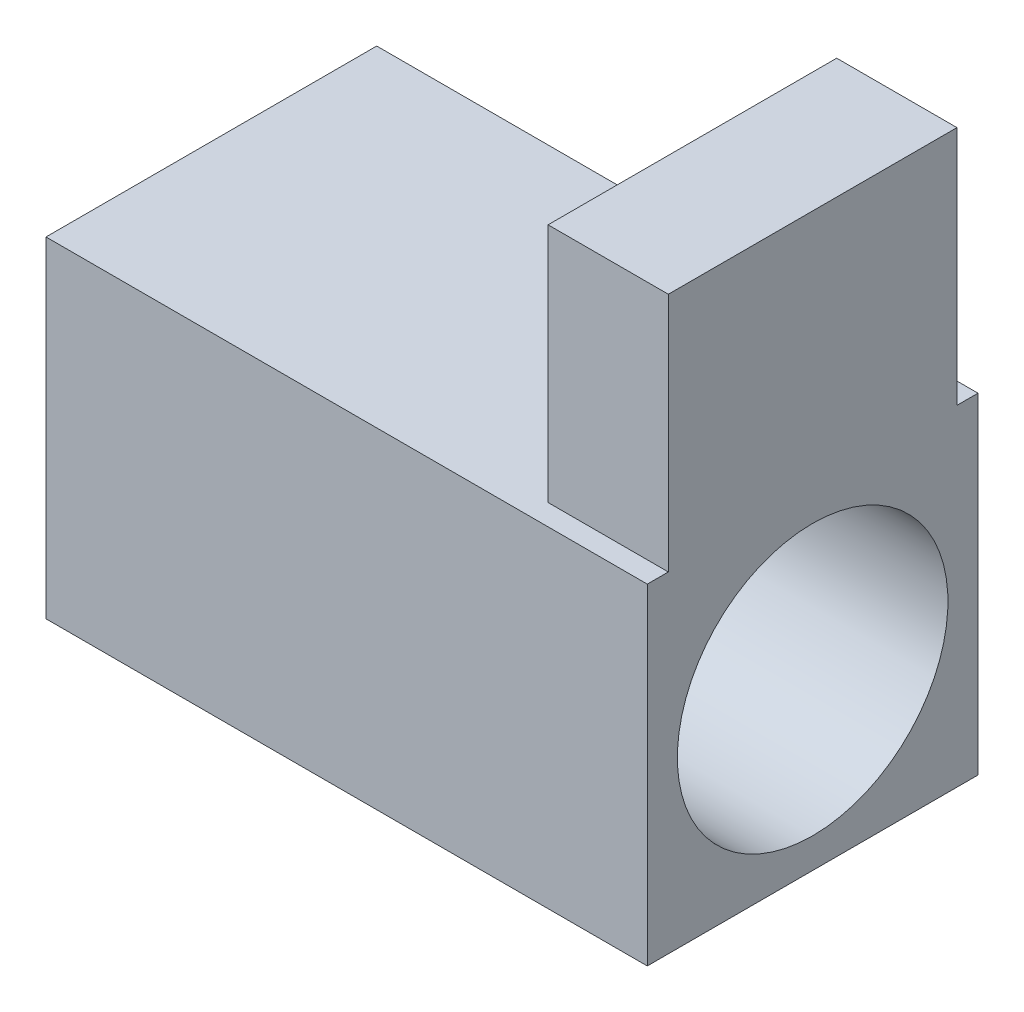
ISO-10303-21;
HEADER;
FILE_DESCRIPTION(('STEP AP214'),'2;1');
FILE_NAME('part.step','',(''),(''),'','','');
FILE_SCHEMA(('AUTOMOTIVE_DESIGN { 1 0 10303 214 1 1 1 1 }'));
ENDSEC;
DATA;
#1=APPLICATION_CONTEXT('core data for automotive mechanical design processes');
#2=APPLICATION_PROTOCOL_DEFINITION('international standard','automotive_design',2000,#1);
#3=PRODUCT_CONTEXT('',#1,'mechanical');
#4=PRODUCT('Part','Part','',(#3));
#5=PRODUCT_RELATED_PRODUCT_CATEGORY('part','',(#4));
#6=PRODUCT_DEFINITION_FORMATION('','',#4);
#7=PRODUCT_DEFINITION_CONTEXT('part definition',#1,'design');
#8=PRODUCT_DEFINITION('design','',#6,#7);
#9=PRODUCT_DEFINITION_SHAPE('','',#8);
#10=(LENGTH_UNIT() NAMED_UNIT(*) SI_UNIT(.MILLI.,.METRE.));
#11=(NAMED_UNIT(*) PLANE_ANGLE_UNIT() SI_UNIT($,.RADIAN.));
#12=(NAMED_UNIT(*) SI_UNIT($,.STERADIAN.) SOLID_ANGLE_UNIT());
#13=UNCERTAINTY_MEASURE_WITH_UNIT(LENGTH_MEASURE(1.E-05),#10,'distance_accuracy_value','');
#14=(GEOMETRIC_REPRESENTATION_CONTEXT(3) GLOBAL_UNCERTAINTY_ASSIGNED_CONTEXT((#13)) GLOBAL_UNIT_ASSIGNED_CONTEXT((#10,
#11,#12)) REPRESENTATION_CONTEXT('',''));
#15=CARTESIAN_POINT('',(0.,0.,0.));
#16=DIRECTION('',(0.,0.,1.));
#17=DIRECTION('',(1.,0.,0.));
#18=AXIS2_PLACEMENT_3D('',#15,#16,#17);
#19=CARTESIAN_POINT('',(-5.,2.75,2.75));
#20=DIRECTION('',(0.,-1.,0.));
#21=DIRECTION('',(0.,0.,-1.));
#22=AXIS2_PLACEMENT_3D('',#19,#20,#21);
#23=PLANE('',#22);
#24=DIRECTION('',(1.,0.,0.));
#25=VECTOR('',#24,1.);
#26=CARTESIAN_POINT('',(3.,2.75,2.4));
#27=LINE('',#26,#25);
#28=CARTESIAN_POINT('',(3.,2.75,2.4));
#29=VERTEX_POINT('',#28);
#30=CARTESIAN_POINT('',(5.,2.75,2.4));
#31=VERTEX_POINT('',#30);
#32=EDGE_CURVE('E52',#29,#31,#27,.T.);
#33=ORIENTED_EDGE('',*,*,#32,.F.);
#34=DIRECTION('',(0.,0.,1.));
#35=VECTOR('',#34,1.);
#36=CARTESIAN_POINT('',(3.,2.75,-2.4));
#37=LINE('',#36,#35);
#38=CARTESIAN_POINT('',(3.,2.75,-2.4));
#39=VERTEX_POINT('',#38);
#40=EDGE_CURVE('E185',#39,#29,#37,.T.);
#41=ORIENTED_EDGE('',*,*,#40,.F.);
#42=DIRECTION('',(-1.,0.,0.));
#43=VECTOR('',#42,1.);
#44=CARTESIAN_POINT('',(3.,2.75,-2.4));
#45=LINE('',#44,#43);
#46=CARTESIAN_POINT('',(5.,2.75,-2.4));
#47=VERTEX_POINT('',#46);
#48=EDGE_CURVE('E56',#47,#39,#45,.T.);
#49=ORIENTED_EDGE('',*,*,#48,.F.);
#50=DIRECTION('',(0.,0.,-1.));
#51=VECTOR('',#50,1.);
#52=CARTESIAN_POINT('',(5.,2.75,2.75));
#53=LINE('',#52,#51);
#54=CARTESIAN_POINT('',(5.,2.75,-2.75));
#55=VERTEX_POINT('',#54);
#56=EDGE_CURVE('E50',#47,#55,#53,.T.);
#57=ORIENTED_EDGE('',*,*,#56,.T.);
#58=DIRECTION('',(-1.,0.,0.));
#59=VECTOR('',#58,1.);
#60=CARTESIAN_POINT('',(-5.,2.75,-2.75));
#61=LINE('',#60,#59);
#62=CARTESIAN_POINT('',(-5.,2.75,-2.75));
#63=VERTEX_POINT('',#62);
#64=EDGE_CURVE('E150',#55,#63,#61,.T.);
#65=ORIENTED_EDGE('',*,*,#64,.T.);
#66=DIRECTION('',(0.,0.,-1.));
#67=VECTOR('',#66,1.);
#68=CARTESIAN_POINT('',(-5.,2.75,2.75));
#69=LINE('',#68,#67);
#70=CARTESIAN_POINT('',(-5.,2.75,2.75));
#71=VERTEX_POINT('',#70);
#72=EDGE_CURVE('E156',#71,#63,#69,.T.);
#73=ORIENTED_EDGE('',*,*,#72,.F.);
#74=DIRECTION('',(-1.,0.,0.));
#75=VECTOR('',#74,1.);
#76=CARTESIAN_POINT('',(-5.,2.75,2.75));
#77=LINE('',#76,#75);
#78=CARTESIAN_POINT('',(5.,2.75,2.75));
#79=VERTEX_POINT('',#78);
#80=EDGE_CURVE('E140',#79,#71,#77,.T.);
#81=ORIENTED_EDGE('',*,*,#80,.F.);
#82=EDGE_CURVE('E11',#79,#31,#53,.T.);
#83=ORIENTED_EDGE('',*,*,#82,.T.);
#84=EDGE_LOOP('',(#33,#41,#49,#57,#65,#73,#81,#83));
#85=FACE_BOUND('',#84,.T.);
#86=ADVANCED_FACE('F39',(#85),#23,.F.);
#87=CARTESIAN_POINT('',(5.,2.75,2.75));
#88=DIRECTION('',(-1.,0.,0.));
#89=DIRECTION('',(0.,0.,1.));
#90=AXIS2_PLACEMENT_3D('',#87,#88,#89);
#91=PLANE('',#90);
#92=CARTESIAN_POINT('',(5.,0.,0.));
#93=DIRECTION('',(1.,0.,0.));
#94=DIRECTION('',(0.,1.,0.));
#95=AXIS2_PLACEMENT_3D('',#92,#93,#94);
#96=CIRCLE('',#95,2.25);
#97=CARTESIAN_POINT('',(5.,2.25,0.));
#98=VERTEX_POINT('',#97);
#99=EDGE_CURVE('E125',#98,#98,#96,.T.);
#100=ORIENTED_EDGE('',*,*,#99,.F.);
#101=EDGE_LOOP('',(#100));
#102=FACE_BOUND('',#101,.T.);
#103=DIRECTION('',(0.,1.,0.));
#104=VECTOR('',#103,1.);
#105=CARTESIAN_POINT('',(5.,2.75,-2.75));
#106=LINE('',#105,#104);
#107=CARTESIAN_POINT('',(5.,-2.75,-2.75));
#108=VERTEX_POINT('',#107);
#109=EDGE_CURVE('E135',#108,#55,#106,.T.);
#110=ORIENTED_EDGE('',*,*,#109,.T.);
#111=ORIENTED_EDGE('',*,*,#56,.F.);
#112=DIRECTION('',(0.,-1.,0.));
#113=VECTOR('',#112,1.);
#114=CARTESIAN_POINT('',(5.,6.75,-2.4));
#115=LINE('',#114,#113);
#116=CARTESIAN_POINT('',(5.,6.75,-2.4));
#117=VERTEX_POINT('',#116);
#118=EDGE_CURVE('E106',#117,#47,#115,.T.);
#119=ORIENTED_EDGE('',*,*,#118,.F.);
#120=DIRECTION('',(0.,0.,-1.));
#121=VECTOR('',#120,1.);
#122=CARTESIAN_POINT('',(5.,6.75,-2.4));
#123=LINE('',#122,#121);
#124=CARTESIAN_POINT('',(5.,6.75,2.4));
#125=VERTEX_POINT('',#124);
#126=EDGE_CURVE('E115',#125,#117,#123,.T.);
#127=ORIENTED_EDGE('',*,*,#126,.F.);
#128=DIRECTION('',(0.,-1.,0.));
#129=VECTOR('',#128,1.);
#130=CARTESIAN_POINT('',(5.,6.75,2.4));
#131=LINE('',#130,#129);
#132=EDGE_CURVE('E177',#125,#31,#131,.T.);
#133=ORIENTED_EDGE('',*,*,#132,.T.);
#134=ORIENTED_EDGE('',*,*,#82,.F.);
#135=DIRECTION('',(0.,1.,0.));
#136=VECTOR('',#135,1.);
#137=CARTESIAN_POINT('',(5.,2.75,2.75));
#138=LINE('',#137,#136);
#139=CARTESIAN_POINT('',(5.,-2.75,2.75));
#140=VERTEX_POINT('',#139);
#141=EDGE_CURVE('E132',#140,#79,#138,.T.);
#142=ORIENTED_EDGE('',*,*,#141,.F.);
#143=DIRECTION('',(0.,0.,-1.));
#144=VECTOR('',#143,1.);
#145=CARTESIAN_POINT('',(5.,-2.75,2.75));
#146=LINE('',#145,#144);
#147=EDGE_CURVE('E144',#140,#108,#146,.T.);
#148=ORIENTED_EDGE('',*,*,#147,.T.);
#149=EDGE_LOOP('',(#110,#111,#119,#127,#133,#134,#142,#148));
#150=FACE_BOUND('',#149,.T.);
#151=ADVANCED_FACE('F41',(#102,#150),#91,.F.);
#152=CARTESIAN_POINT('',(-5.,2.75,2.75));
#153=DIRECTION('',(1.,0.,0.));
#154=DIRECTION('',(0.,1.,0.));
#155=AXIS2_PLACEMENT_3D('',#152,#153,#154);
#156=PLANE('',#155);
#157=DIRECTION('',(0.,-1.,0.));
#158=VECTOR('',#157,1.);
#159=CARTESIAN_POINT('',(-5.,2.75,-2.75));
#160=LINE('',#159,#158);
#161=CARTESIAN_POINT('',(-5.,-2.75,-2.75));
#162=VERTEX_POINT('',#161);
#163=EDGE_CURVE('E149',#63,#162,#160,.T.);
#164=ORIENTED_EDGE('',*,*,#163,.T.);
#165=DIRECTION('',(0.,0.,-1.));
#166=VECTOR('',#165,1.);
#167=CARTESIAN_POINT('',(-5.,-2.75,2.75));
#168=LINE('',#167,#166);
#169=CARTESIAN_POINT('',(-5.,-2.75,2.75));
#170=VERTEX_POINT('',#169);
#171=EDGE_CURVE('E152',#170,#162,#168,.T.);
#172=ORIENTED_EDGE('',*,*,#171,.F.);
#173=DIRECTION('',(0.,-1.,0.));
#174=VECTOR('',#173,1.);
#175=CARTESIAN_POINT('',(-5.,2.75,2.75));
#176=LINE('',#175,#174);
#177=EDGE_CURVE('E143',#71,#170,#176,.T.);
#178=ORIENTED_EDGE('',*,*,#177,.F.);
#179=ORIENTED_EDGE('',*,*,#72,.T.);
#180=EDGE_LOOP('',(#164,#172,#178,#179));
#181=FACE_BOUND('',#180,.T.);
#182=ADVANCED_FACE('F173',(#181),#156,.F.);
#183=CARTESIAN_POINT('',(-5.,-2.75,2.75));
#184=DIRECTION('',(0.,1.,0.));
#185=DIRECTION('',(0.,0.,1.));
#186=AXIS2_PLACEMENT_3D('',#183,#184,#185);
#187=PLANE('',#186);
#188=DIRECTION('',(1.,0.,0.));
#189=VECTOR('',#188,1.);
#190=CARTESIAN_POINT('',(-5.,-2.75,-2.75));
#191=LINE('',#190,#189);
#192=EDGE_CURVE('E138',#162,#108,#191,.T.);
#193=ORIENTED_EDGE('',*,*,#192,.T.);
#194=ORIENTED_EDGE('',*,*,#147,.F.);
#195=DIRECTION('',(1.,0.,0.));
#196=VECTOR('',#195,1.);
#197=CARTESIAN_POINT('',(-5.,-2.75,2.75));
#198=LINE('',#197,#196);
#199=EDGE_CURVE('E141',#170,#140,#198,.T.);
#200=ORIENTED_EDGE('',*,*,#199,.F.);
#201=ORIENTED_EDGE('',*,*,#171,.T.);
#202=EDGE_LOOP('',(#193,#194,#200,#201));
#203=FACE_BOUND('',#202,.T.);
#204=ADVANCED_FACE('F171',(#203),#187,.F.);
#205=CARTESIAN_POINT('',(0.,0.,2.75));
#206=DIRECTION('',(0.,0.,1.));
#207=DIRECTION('',(1.,0.,0.));
#208=AXIS2_PLACEMENT_3D('',#205,#206,#207);
#209=PLANE('',#208);
#210=ORIENTED_EDGE('',*,*,#141,.T.);
#211=ORIENTED_EDGE('',*,*,#80,.T.);
#212=ORIENTED_EDGE('',*,*,#177,.T.);
#213=ORIENTED_EDGE('',*,*,#199,.T.);
#214=EDGE_LOOP('',(#210,#211,#212,#213));
#215=FACE_BOUND('',#214,.T.);
#216=ADVANCED_FACE('F179',(#215),#209,.T.);
#217=CARTESIAN_POINT('',(0.,0.,-2.75));
#218=DIRECTION('',(0.,0.,1.));
#219=DIRECTION('',(1.,0.,0.));
#220=AXIS2_PLACEMENT_3D('',#217,#218,#219);
#221=PLANE('',#220);
#222=ORIENTED_EDGE('',*,*,#109,.F.);
#223=ORIENTED_EDGE('',*,*,#192,.F.);
#224=ORIENTED_EDGE('',*,*,#163,.F.);
#225=ORIENTED_EDGE('',*,*,#64,.F.);
#226=EDGE_LOOP('',(#222,#223,#224,#225));
#227=FACE_BOUND('',#226,.T.);
#228=ADVANCED_FACE('F164',(#227),#221,.F.);
#229=CARTESIAN_POINT('',(0.,0.,0.));
#230=DIRECTION('',(1.,0.,0.));
#231=DIRECTION('',(0.,1.,0.));
#232=AXIS2_PLACEMENT_3D('',#229,#230,#231);
#233=CYLINDRICAL_SURFACE('',#232,2.25);
#234=CARTESIAN_POINT('',(0.,0.,0.));
#235=DIRECTION('',(1.,0.,0.));
#236=DIRECTION('',(0.,1.,0.));
#237=AXIS2_PLACEMENT_3D('',#234,#235,#236);
#238=CIRCLE('',#237,2.25);
#239=CARTESIAN_POINT('',(0.,2.25,0.));
#240=VERTEX_POINT('',#239);
#241=EDGE_CURVE('E127',#240,#240,#238,.T.);
#242=ORIENTED_EDGE('',*,*,#241,.F.);
#243=EDGE_LOOP('',(#242));
#244=FACE_BOUND('',#243,.T.);
#245=ORIENTED_EDGE('',*,*,#99,.T.);
#246=EDGE_LOOP('',(#245));
#247=FACE_BOUND('',#246,.T.);
#248=ADVANCED_FACE('F213',(#244,#247),#233,.F.);
#249=CARTESIAN_POINT('',(0.,0.,0.));
#250=DIRECTION('',(1.,0.,0.));
#251=DIRECTION('',(0.,1.,0.));
#252=AXIS2_PLACEMENT_3D('',#249,#250,#251);
#253=PLANE('',#252);
#254=ORIENTED_EDGE('',*,*,#241,.T.);
#255=EDGE_LOOP('',(#254));
#256=FACE_BOUND('',#255,.T.);
#257=ADVANCED_FACE('F196',(#256),#253,.T.);
#258=CARTESIAN_POINT('',(3.,6.75,-2.4));
#259=DIRECTION('',(0.,0.,1.));
#260=DIRECTION('',(1.,0.,0.));
#261=AXIS2_PLACEMENT_3D('',#258,#259,#260);
#262=PLANE('',#261);
#263=ORIENTED_EDGE('',*,*,#48,.T.);
#264=DIRECTION('',(0.,-1.,0.));
#265=VECTOR('',#264,1.);
#266=CARTESIAN_POINT('',(3.,6.75,-2.4));
#267=LINE('',#266,#265);
#268=CARTESIAN_POINT('',(3.,6.75,-2.4));
#269=VERTEX_POINT('',#268);
#270=EDGE_CURVE('E107',#269,#39,#267,.T.);
#271=ORIENTED_EDGE('',*,*,#270,.F.);
#272=DIRECTION('',(-1.,0.,0.));
#273=VECTOR('',#272,1.);
#274=CARTESIAN_POINT('',(3.,6.75,-2.4));
#275=LINE('',#274,#273);
#276=EDGE_CURVE('E105',#117,#269,#275,.T.);
#277=ORIENTED_EDGE('',*,*,#276,.F.);
#278=ORIENTED_EDGE('',*,*,#118,.T.);
#279=EDGE_LOOP('',(#263,#271,#277,#278));
#280=FACE_BOUND('',#279,.T.);
#281=ADVANCED_FACE('F102',(#280),#262,.F.);
#282=CARTESIAN_POINT('',(3.,6.75,-2.4));
#283=DIRECTION('',(1.,0.,0.));
#284=DIRECTION('',(0.,0.,-1.));
#285=AXIS2_PLACEMENT_3D('',#282,#283,#284);
#286=PLANE('',#285);
#287=ORIENTED_EDGE('',*,*,#40,.T.);
#288=DIRECTION('',(0.,-1.,0.));
#289=VECTOR('',#288,1.);
#290=CARTESIAN_POINT('',(3.,6.75,2.4));
#291=LINE('',#290,#289);
#292=CARTESIAN_POINT('',(3.,6.75,2.4));
#293=VERTEX_POINT('',#292);
#294=EDGE_CURVE('E126',#293,#29,#291,.T.);
#295=ORIENTED_EDGE('',*,*,#294,.F.);
#296=DIRECTION('',(0.,0.,1.));
#297=VECTOR('',#296,1.);
#298=CARTESIAN_POINT('',(3.,6.75,-2.4));
#299=LINE('',#298,#297);
#300=EDGE_CURVE('E112',#269,#293,#299,.T.);
#301=ORIENTED_EDGE('',*,*,#300,.F.);
#302=ORIENTED_EDGE('',*,*,#270,.T.);
#303=EDGE_LOOP('',(#287,#295,#301,#302));
#304=FACE_BOUND('',#303,.T.);
#305=ADVANCED_FACE('F187',(#304),#286,.F.);
#306=CARTESIAN_POINT('',(3.,6.75,2.4));
#307=DIRECTION('',(0.,0.,-1.));
#308=DIRECTION('',(-1.,0.,0.));
#309=AXIS2_PLACEMENT_3D('',#306,#307,#308);
#310=PLANE('',#309);
#311=ORIENTED_EDGE('',*,*,#32,.T.);
#312=ORIENTED_EDGE('',*,*,#132,.F.);
#313=DIRECTION('',(1.,0.,0.));
#314=VECTOR('',#313,1.);
#315=CARTESIAN_POINT('',(3.,6.75,2.4));
#316=LINE('',#315,#314);
#317=EDGE_CURVE('E116',#293,#125,#316,.T.);
#318=ORIENTED_EDGE('',*,*,#317,.F.);
#319=ORIENTED_EDGE('',*,*,#294,.T.);
#320=EDGE_LOOP('',(#311,#312,#318,#319));
#321=FACE_BOUND('',#320,.T.);
#322=ADVANCED_FACE('F178',(#321),#310,.F.);
#323=CARTESIAN_POINT('',(0.,6.75,0.));
#324=DIRECTION('',(0.,1.,0.));
#325=DIRECTION('',(0.,0.,1.));
#326=AXIS2_PLACEMENT_3D('',#323,#324,#325);
#327=PLANE('',#326);
#328=ORIENTED_EDGE('',*,*,#126,.T.);
#329=ORIENTED_EDGE('',*,*,#276,.T.);
#330=ORIENTED_EDGE('',*,*,#300,.T.);
#331=ORIENTED_EDGE('',*,*,#317,.T.);
#332=EDGE_LOOP('',(#328,#329,#330,#331));
#333=FACE_BOUND('',#332,.T.);
#334=ADVANCED_FACE('F113',(#333),#327,.T.);
#335=CLOSED_SHELL('',(#86,#151,#182,#204,#216,#228,#248,#257,#281,#305,#322,#334));
#336=MANIFOLD_SOLID_BREP('B2',#335);
#337=ADVANCED_BREP_SHAPE_REPRESENTATION('',(#18,#336),#14);
#338=SHAPE_DEFINITION_REPRESENTATION(#9,#337);
ENDSEC;
END-ISO-10303-21;
